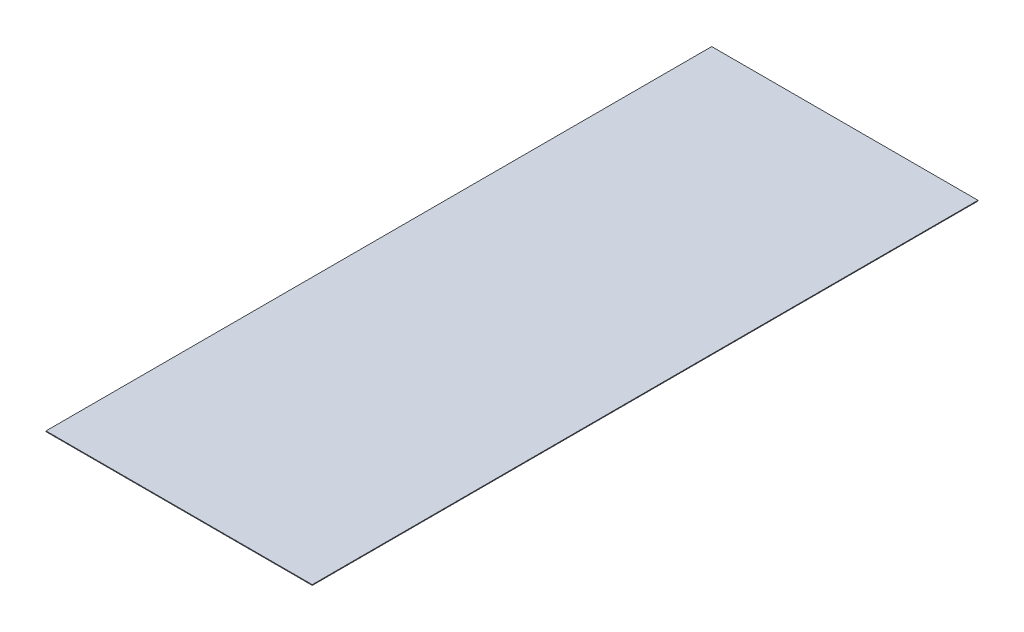
ISO-10303-21;
HEADER;
FILE_DESCRIPTION(('STEP AP214'),'2;1');
FILE_NAME('part.step','',(''),(''),'','','');
FILE_SCHEMA(('AUTOMOTIVE_DESIGN { 1 0 10303 214 1 1 1 1 }'));
ENDSEC;
DATA;
#1=APPLICATION_CONTEXT('core data for automotive mechanical design processes');
#2=APPLICATION_PROTOCOL_DEFINITION('international standard','automotive_design',2000,#1);
#3=PRODUCT_CONTEXT('',#1,'mechanical');
#4=PRODUCT('Part','Part','',(#3));
#5=PRODUCT_RELATED_PRODUCT_CATEGORY('part','',(#4));
#6=PRODUCT_DEFINITION_FORMATION('','',#4);
#7=PRODUCT_DEFINITION_CONTEXT('part definition',#1,'design');
#8=PRODUCT_DEFINITION('design','',#6,#7);
#9=PRODUCT_DEFINITION_SHAPE('','',#8);
#10=(LENGTH_UNIT() NAMED_UNIT(*) SI_UNIT(.MILLI.,.METRE.));
#11=(NAMED_UNIT(*) PLANE_ANGLE_UNIT() SI_UNIT($,.RADIAN.));
#12=(NAMED_UNIT(*) SI_UNIT($,.STERADIAN.) SOLID_ANGLE_UNIT());
#13=UNCERTAINTY_MEASURE_WITH_UNIT(LENGTH_MEASURE(1.E-05),#10,'distance_accuracy_value','');
#14=(GEOMETRIC_REPRESENTATION_CONTEXT(3) GLOBAL_UNCERTAINTY_ASSIGNED_CONTEXT((#13)) GLOBAL_UNIT_ASSIGNED_CONTEXT((#10,
#11,#12)) REPRESENTATION_CONTEXT('',''));
#15=CARTESIAN_POINT('',(0.,0.,0.));
#16=DIRECTION('',(0.,0.,1.));
#17=DIRECTION('',(1.,0.,0.));
#18=AXIS2_PLACEMENT_3D('',#15,#16,#17);
#19=CARTESIAN_POINT('',(609.6,3.2,1524.));
#20=DIRECTION('',(-1.,0.,0.));
#21=DIRECTION('',(0.,0.,1.));
#22=AXIS2_PLACEMENT_3D('',#19,#20,#21);
#23=PLANE('',#22);
#24=DIRECTION('',(0.,0.,-1.));
#25=VECTOR('',#24,1.);
#26=CARTESIAN_POINT('',(609.6,0.,1524.));
#27=LINE('',#26,#25);
#28=CARTESIAN_POINT('',(609.6,0.,1524.));
#29=VERTEX_POINT('',#28);
#30=CARTESIAN_POINT('',(609.6,0.,-1524.));
#31=VERTEX_POINT('',#30);
#32=EDGE_CURVE('E96',#29,#31,#27,.T.);
#33=ORIENTED_EDGE('',*,*,#32,.T.);
#34=DIRECTION('',(0.,-1.,0.));
#35=VECTOR('',#34,1.);
#36=CARTESIAN_POINT('',(609.6,3.2,-1524.));
#37=LINE('',#36,#35);
#38=CARTESIAN_POINT('',(609.6,3.2,-1524.));
#39=VERTEX_POINT('',#38);
#40=EDGE_CURVE('E11',#39,#31,#37,.T.);
#41=ORIENTED_EDGE('',*,*,#40,.F.);
#42=DIRECTION('',(0.,0.,-1.));
#43=VECTOR('',#42,1.);
#44=CARTESIAN_POINT('',(609.6,3.2,1524.));
#45=LINE('',#44,#43);
#46=CARTESIAN_POINT('',(609.6,3.2,1524.));
#47=VERTEX_POINT('',#46);
#48=EDGE_CURVE('E84',#47,#39,#45,.T.);
#49=ORIENTED_EDGE('',*,*,#48,.F.);
#50=DIRECTION('',(0.,-1.,0.));
#51=VECTOR('',#50,1.);
#52=CARTESIAN_POINT('',(609.6,3.2,1524.));
#53=LINE('',#52,#51);
#54=EDGE_CURVE('E92',#47,#29,#53,.T.);
#55=ORIENTED_EDGE('',*,*,#54,.T.);
#56=EDGE_LOOP('',(#33,#41,#49,#55));
#57=FACE_BOUND('',#56,.T.);
#58=ADVANCED_FACE('F33',(#57),#23,.F.);
#59=CARTESIAN_POINT('',(-609.6,3.2,-1524.));
#60=DIRECTION('',(0.,0.,1.));
#61=DIRECTION('',(1.,0.,0.));
#62=AXIS2_PLACEMENT_3D('',#59,#60,#61);
#63=PLANE('',#62);
#64=DIRECTION('',(-1.,0.,0.));
#65=VECTOR('',#64,1.);
#66=CARTESIAN_POINT('',(-609.6,0.,-1524.));
#67=LINE('',#66,#65);
#68=CARTESIAN_POINT('',(-609.6,0.,-1524.));
#69=VERTEX_POINT('',#68);
#70=EDGE_CURVE('E88',#31,#69,#67,.T.);
#71=ORIENTED_EDGE('',*,*,#70,.T.);
#72=DIRECTION('',(0.,-1.,0.));
#73=VECTOR('',#72,1.);
#74=CARTESIAN_POINT('',(-609.6,3.2,-1524.));
#75=LINE('',#74,#73);
#76=CARTESIAN_POINT('',(-609.6,3.2,-1524.));
#77=VERTEX_POINT('',#76);
#78=EDGE_CURVE('E41',#77,#69,#75,.T.);
#79=ORIENTED_EDGE('',*,*,#78,.F.);
#80=DIRECTION('',(-1.,0.,0.));
#81=VECTOR('',#80,1.);
#82=CARTESIAN_POINT('',(-609.6,3.2,-1524.));
#83=LINE('',#82,#81);
#84=EDGE_CURVE('E79',#39,#77,#83,.T.);
#85=ORIENTED_EDGE('',*,*,#84,.F.);
#86=ORIENTED_EDGE('',*,*,#40,.T.);
#87=EDGE_LOOP('',(#71,#79,#85,#86));
#88=FACE_BOUND('',#87,.T.);
#89=ADVANCED_FACE('F87',(#88),#63,.F.);
#90=CARTESIAN_POINT('',(-609.6,3.2,1524.));
#91=DIRECTION('',(1.,0.,0.));
#92=DIRECTION('',(0.,0.,-1.));
#93=AXIS2_PLACEMENT_3D('',#90,#91,#92);
#94=PLANE('',#93);
#95=DIRECTION('',(0.,0.,1.));
#96=VECTOR('',#95,1.);
#97=CARTESIAN_POINT('',(-609.6,0.,1524.));
#98=LINE('',#97,#96);
#99=CARTESIAN_POINT('',(-609.6,0.,1524.));
#100=VERTEX_POINT('',#99);
#101=EDGE_CURVE('E66',#69,#100,#98,.T.);
#102=ORIENTED_EDGE('',*,*,#101,.T.);
#103=DIRECTION('',(0.,-1.,0.));
#104=VECTOR('',#103,1.);
#105=CARTESIAN_POINT('',(-609.6,3.2,1524.));
#106=LINE('',#105,#104);
#107=CARTESIAN_POINT('',(-609.6,3.2,1524.));
#108=VERTEX_POINT('',#107);
#109=EDGE_CURVE('E89',#108,#100,#106,.T.);
#110=ORIENTED_EDGE('',*,*,#109,.F.);
#111=DIRECTION('',(0.,0.,1.));
#112=VECTOR('',#111,1.);
#113=CARTESIAN_POINT('',(-609.6,3.2,1524.));
#114=LINE('',#113,#112);
#115=EDGE_CURVE('E82',#77,#108,#114,.T.);
#116=ORIENTED_EDGE('',*,*,#115,.F.);
#117=ORIENTED_EDGE('',*,*,#78,.T.);
#118=EDGE_LOOP('',(#102,#110,#116,#117));
#119=FACE_BOUND('',#118,.T.);
#120=ADVANCED_FACE('F90',(#119),#94,.F.);
#121=CARTESIAN_POINT('',(-609.6,3.2,1524.));
#122=DIRECTION('',(0.,0.,-1.));
#123=DIRECTION('',(-1.,0.,0.));
#124=AXIS2_PLACEMENT_3D('',#121,#122,#123);
#125=PLANE('',#124);
#126=DIRECTION('',(1.,0.,0.));
#127=VECTOR('',#126,1.);
#128=CARTESIAN_POINT('',(-609.6,0.,1524.));
#129=LINE('',#128,#127);
#130=EDGE_CURVE('E72',#100,#29,#129,.T.);
#131=ORIENTED_EDGE('',*,*,#130,.T.);
#132=ORIENTED_EDGE('',*,*,#54,.F.);
#133=DIRECTION('',(1.,0.,0.));
#134=VECTOR('',#133,1.);
#135=CARTESIAN_POINT('',(-609.6,3.2,1524.));
#136=LINE('',#135,#134);
#137=EDGE_CURVE('E49',#108,#47,#136,.T.);
#138=ORIENTED_EDGE('',*,*,#137,.F.);
#139=ORIENTED_EDGE('',*,*,#109,.T.);
#140=EDGE_LOOP('',(#131,#132,#138,#139));
#141=FACE_BOUND('',#140,.T.);
#142=ADVANCED_FACE('F103',(#141),#125,.F.);
#143=CARTESIAN_POINT('',(0.,3.2,0.));
#144=DIRECTION('',(0.,-1.,0.));
#145=DIRECTION('',(0.,0.,-1.));
#146=AXIS2_PLACEMENT_3D('',#143,#144,#145);
#147=PLANE('',#146);
#148=ORIENTED_EDGE('',*,*,#48,.T.);
#149=ORIENTED_EDGE('',*,*,#84,.T.);
#150=ORIENTED_EDGE('',*,*,#115,.T.);
#151=ORIENTED_EDGE('',*,*,#137,.T.);
#152=EDGE_LOOP('',(#148,#149,#150,#151));
#153=FACE_BOUND('',#152,.T.);
#154=ADVANCED_FACE('F80',(#153),#147,.F.);
#155=CARTESIAN_POINT('',(0.,0.,0.));
#156=DIRECTION('',(0.,-1.,0.));
#157=DIRECTION('',(0.,0.,-1.));
#158=AXIS2_PLACEMENT_3D('',#155,#156,#157);
#159=PLANE('',#158);
#160=ORIENTED_EDGE('',*,*,#32,.F.);
#161=ORIENTED_EDGE('',*,*,#130,.F.);
#162=ORIENTED_EDGE('',*,*,#101,.F.);
#163=ORIENTED_EDGE('',*,*,#70,.F.);
#164=EDGE_LOOP('',(#160,#161,#162,#163));
#165=FACE_BOUND('',#164,.T.);
#166=ADVANCED_FACE('F106',(#165),#159,.T.);
#167=CLOSED_SHELL('',(#58,#89,#120,#142,#154,#166));
#168=MANIFOLD_SOLID_BREP('B2',#167);
#169=ADVANCED_BREP_SHAPE_REPRESENTATION('',(#18,#168),#14);
#170=SHAPE_DEFINITION_REPRESENTATION(#9,#169);
ENDSEC;
END-ISO-10303-21;
